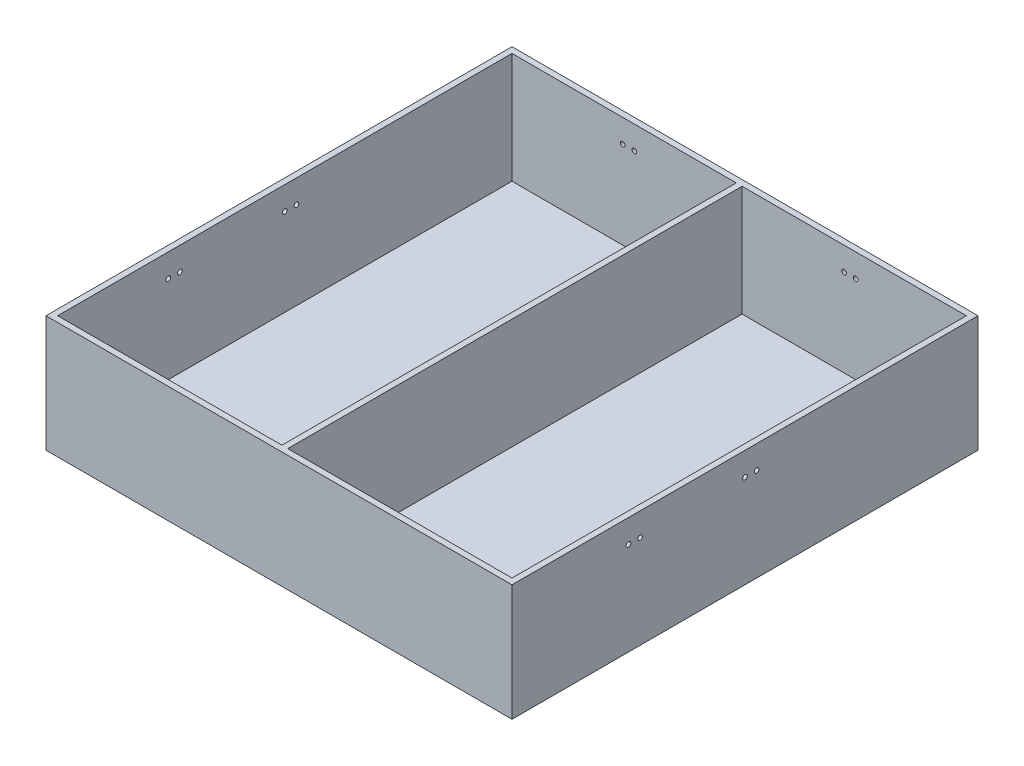
ISO-10303-21;
HEADER;
FILE_DESCRIPTION(('STEP AP214'),'2;1');
FILE_NAME('part.step','',(''),(''),'','','');
FILE_SCHEMA(('AUTOMOTIVE_DESIGN { 1 0 10303 214 1 1 1 1 }'));
ENDSEC;
DATA;
#1=APPLICATION_CONTEXT('core data for automotive mechanical design processes');
#2=APPLICATION_PROTOCOL_DEFINITION('international standard','automotive_design',2000,#1);
#3=PRODUCT_CONTEXT('',#1,'mechanical');
#4=PRODUCT('Part','Part','',(#3));
#5=PRODUCT_RELATED_PRODUCT_CATEGORY('part','',(#4));
#6=PRODUCT_DEFINITION_FORMATION('','',#4);
#7=PRODUCT_DEFINITION_CONTEXT('part definition',#1,'design');
#8=PRODUCT_DEFINITION('design','',#6,#7);
#9=PRODUCT_DEFINITION_SHAPE('','',#8);
#10=(LENGTH_UNIT() NAMED_UNIT(*) SI_UNIT(.MILLI.,.METRE.));
#11=(NAMED_UNIT(*) PLANE_ANGLE_UNIT() SI_UNIT($,.RADIAN.));
#12=(NAMED_UNIT(*) SI_UNIT($,.STERADIAN.) SOLID_ANGLE_UNIT());
#13=UNCERTAINTY_MEASURE_WITH_UNIT(LENGTH_MEASURE(1.E-05),#10,'distance_accuracy_value','');
#14=(GEOMETRIC_REPRESENTATION_CONTEXT(3) GLOBAL_UNCERTAINTY_ASSIGNED_CONTEXT((#13)) GLOBAL_UNIT_ASSIGNED_CONTEXT((#10,
#11,#12)) REPRESENTATION_CONTEXT('',''));
#15=CARTESIAN_POINT('',(0.,0.,0.));
#16=DIRECTION('',(0.,0.,1.));
#17=DIRECTION('',(1.,0.,0.));
#18=AXIS2_PLACEMENT_3D('',#15,#16,#17);
#19=CARTESIAN_POINT('',(0.,200.,0.));
#20=DIRECTION('',(0.,1.,0.));
#21=DIRECTION('',(0.,0.,1.));
#22=AXIS2_PLACEMENT_3D('',#19,#20,#21);
#23=PLANE('',#22);
#24=DIRECTION('',(0.,0.,1.));
#25=VECTOR('',#24,1.);
#26=CARTESIAN_POINT('',(5.,200.,390.));
#27=LINE('',#26,#25);
#28=CARTESIAN_POINT('',(5.00000000000006,200.,-390.));
#29=VERTEX_POINT('',#28);
#30=CARTESIAN_POINT('',(5.,200.,390.));
#31=VERTEX_POINT('',#30);
#32=EDGE_CURVE('E243',#29,#31,#27,.T.);
#33=ORIENTED_EDGE('',*,*,#32,.F.);
#34=DIRECTION('',(-1.,0.,0.));
#35=VECTOR('',#34,1.);
#36=CARTESIAN_POINT('',(5.00000000000006,200.,-390.));
#37=LINE('',#36,#35);
#38=CARTESIAN_POINT('',(390.,200.,-390.));
#39=VERTEX_POINT('',#38);
#40=EDGE_CURVE('E241',#39,#29,#37,.T.);
#41=ORIENTED_EDGE('',*,*,#40,.F.);
#42=DIRECTION('',(0.,0.,-1.));
#43=VECTOR('',#42,1.);
#44=CARTESIAN_POINT('',(390.,200.,-390.));
#45=LINE('',#44,#43);
#46=CARTESIAN_POINT('',(390.,200.,390.));
#47=VERTEX_POINT('',#46);
#48=EDGE_CURVE('E248',#47,#39,#45,.T.);
#49=ORIENTED_EDGE('',*,*,#48,.F.);
#50=DIRECTION('',(1.,0.,0.));
#51=VECTOR('',#50,1.);
#52=CARTESIAN_POINT('',(5.,200.,390.));
#53=LINE('',#52,#51);
#54=EDGE_CURVE('E245',#31,#47,#53,.T.);
#55=ORIENTED_EDGE('',*,*,#54,.F.);
#56=EDGE_LOOP('',(#33,#41,#49,#55));
#57=FACE_BOUND('',#56,.T.);
#58=DIRECTION('',(1.,0.,0.));
#59=VECTOR('',#58,1.);
#60=CARTESIAN_POINT('',(-390.,200.,390.));
#61=LINE('',#60,#59);
#62=CARTESIAN_POINT('',(-390.,200.,390.));
#63=VERTEX_POINT('',#62);
#64=CARTESIAN_POINT('',(-5.,200.,390.));
#65=VERTEX_POINT('',#64);
#66=EDGE_CURVE('E263',#63,#65,#61,.T.);
#67=ORIENTED_EDGE('',*,*,#66,.F.);
#68=DIRECTION('',(0.,0.,1.));
#69=VECTOR('',#68,1.);
#70=CARTESIAN_POINT('',(-390.,200.,-390.));
#71=LINE('',#70,#69);
#72=CARTESIAN_POINT('',(-390.,200.,-390.));
#73=VERTEX_POINT('',#72);
#74=EDGE_CURVE('E261',#73,#63,#71,.T.);
#75=ORIENTED_EDGE('',*,*,#74,.F.);
#76=DIRECTION('',(-1.,0.,0.));
#77=VECTOR('',#76,1.);
#78=CARTESIAN_POINT('',(-390.,200.,-390.));
#79=LINE('',#78,#77);
#80=CARTESIAN_POINT('',(-5.00000000000006,200.,-390.));
#81=VERTEX_POINT('',#80);
#82=EDGE_CURVE('E268',#81,#73,#79,.T.);
#83=ORIENTED_EDGE('',*,*,#82,.F.);
#84=DIRECTION('',(0.,0.,-1.));
#85=VECTOR('',#84,1.);
#86=CARTESIAN_POINT('',(-5.,200.,390.));
#87=LINE('',#86,#85);
#88=EDGE_CURVE('E265',#65,#81,#87,.T.);
#89=ORIENTED_EDGE('',*,*,#88,.F.);
#90=EDGE_LOOP('',(#67,#75,#83,#89));
#91=FACE_BOUND('',#90,.T.);
#92=DIRECTION('',(1.,0.,0.));
#93=VECTOR('',#92,1.);
#94=CARTESIAN_POINT('',(-400.,200.,-400.));
#95=LINE('',#94,#93);
#96=CARTESIAN_POINT('',(-400.,200.,-400.));
#97=VERTEX_POINT('',#96);
#98=CARTESIAN_POINT('',(400.,200.,-400.));
#99=VERTEX_POINT('',#98);
#100=EDGE_CURVE('E140',#97,#99,#95,.T.);
#101=ORIENTED_EDGE('',*,*,#100,.F.);
#102=DIRECTION('',(0.,0.,-1.));
#103=VECTOR('',#102,1.);
#104=CARTESIAN_POINT('',(-400.,200.,400.));
#105=LINE('',#104,#103);
#106=CARTESIAN_POINT('',(-400.,200.,400.));
#107=VERTEX_POINT('',#106);
#108=EDGE_CURVE('E148',#107,#97,#105,.T.);
#109=ORIENTED_EDGE('',*,*,#108,.F.);
#110=DIRECTION('',(1.,0.,0.));
#111=VECTOR('',#110,1.);
#112=CARTESIAN_POINT('',(-400.,200.,400.));
#113=LINE('',#112,#111);
#114=CARTESIAN_POINT('',(400.,200.,400.));
#115=VERTEX_POINT('',#114);
#116=EDGE_CURVE('E147',#107,#115,#113,.T.);
#117=ORIENTED_EDGE('',*,*,#116,.T.);
#118=DIRECTION('',(0.,0.,1.));
#119=VECTOR('',#118,1.);
#120=CARTESIAN_POINT('',(400.,200.,-400.));
#121=LINE('',#120,#119);
#122=EDGE_CURVE('E131',#99,#115,#121,.T.);
#123=ORIENTED_EDGE('',*,*,#122,.F.);
#124=EDGE_LOOP('',(#101,#109,#117,#123));
#125=FACE_BOUND('',#124,.T.);
#126=ADVANCED_FACE('F37',(#57,#91,#125),#23,.T.);
#127=CARTESIAN_POINT('',(-400.,200.,400.));
#128=DIRECTION('',(0.,0.,-1.));
#129=DIRECTION('',(-1.,0.,0.));
#130=AXIS2_PLACEMENT_3D('',#127,#128,#129);
#131=PLANE('',#130);
#132=ORIENTED_EDGE('',*,*,#116,.F.);
#133=DIRECTION('',(0.,-1.,0.));
#134=VECTOR('',#133,1.);
#135=CARTESIAN_POINT('',(-400.,200.,400.));
#136=LINE('',#135,#134);
#137=CARTESIAN_POINT('',(-400.,0.,400.));
#138=VERTEX_POINT('',#137);
#139=EDGE_CURVE('E290',#107,#138,#136,.T.);
#140=ORIENTED_EDGE('',*,*,#139,.T.);
#141=DIRECTION('',(1.,0.,0.));
#142=VECTOR('',#141,1.);
#143=CARTESIAN_POINT('',(-400.,0.,400.));
#144=LINE('',#143,#142);
#145=CARTESIAN_POINT('',(400.,0.,400.));
#146=VERTEX_POINT('',#145);
#147=EDGE_CURVE('E280',#138,#146,#144,.T.);
#148=ORIENTED_EDGE('',*,*,#147,.T.);
#149=DIRECTION('',(0.,-1.,0.));
#150=VECTOR('',#149,1.);
#151=CARTESIAN_POINT('',(400.,200.,400.));
#152=LINE('',#151,#150);
#153=EDGE_CURVE('E279',#115,#146,#152,.T.);
#154=ORIENTED_EDGE('',*,*,#153,.F.);
#155=EDGE_LOOP('',(#132,#140,#148,#154));
#156=FACE_BOUND('',#155,.T.);
#157=ADVANCED_FACE('F299',(#156),#131,.F.);
#158=CARTESIAN_POINT('',(0.,0.,0.));
#159=DIRECTION('',(0.,1.,0.));
#160=DIRECTION('',(0.,0.,1.));
#161=AXIS2_PLACEMENT_3D('',#158,#159,#160);
#162=PLANE('',#161);
#163=DIRECTION('',(0.,0.,-1.));
#164=VECTOR('',#163,1.);
#165=CARTESIAN_POINT('',(400.,0.,-400.));
#166=LINE('',#165,#164);
#167=CARTESIAN_POINT('',(400.,0.,-400.));
#168=VERTEX_POINT('',#167);
#169=EDGE_CURVE('E134',#146,#168,#166,.T.);
#170=ORIENTED_EDGE('',*,*,#169,.F.);
#171=ORIENTED_EDGE('',*,*,#147,.F.);
#172=DIRECTION('',(0.,0.,1.));
#173=VECTOR('',#172,1.);
#174=CARTESIAN_POINT('',(-400.,0.,-400.));
#175=LINE('',#174,#173);
#176=CARTESIAN_POINT('',(-400.,0.,-400.));
#177=VERTEX_POINT('',#176);
#178=EDGE_CURVE('E284',#177,#138,#175,.T.);
#179=ORIENTED_EDGE('',*,*,#178,.F.);
#180=DIRECTION('',(-1.,0.,0.));
#181=VECTOR('',#180,1.);
#182=CARTESIAN_POINT('',(-400.,0.,-400.));
#183=LINE('',#182,#181);
#184=EDGE_CURVE('E282',#168,#177,#183,.T.);
#185=ORIENTED_EDGE('',*,*,#184,.F.);
#186=EDGE_LOOP('',(#170,#171,#179,#185));
#187=FACE_BOUND('',#186,.T.);
#188=ADVANCED_FACE('F297',(#187),#162,.F.);
#189=CARTESIAN_POINT('',(400.,200.,-400.));
#190=DIRECTION('',(-1.,0.,0.));
#191=DIRECTION('',(0.,0.,1.));
#192=AXIS2_PLACEMENT_3D('',#189,#190,#191);
#193=PLANE('',#192);
#194=CARTESIAN_POINT('',(400.,159.999999999999,-20.));
#195=DIRECTION('',(-1.,0.,0.));
#196=DIRECTION('',(0.,0.,1.));
#197=AXIS2_PLACEMENT_3D('',#194,#195,#196);
#198=CIRCLE('',#197,3.99999999999999);
#199=CARTESIAN_POINT('',(400.,159.999999999999,-16.));
#200=VERTEX_POINT('',#199);
#201=EDGE_CURVE('E179',#200,#200,#198,.T.);
#202=ORIENTED_EDGE('',*,*,#201,.T.);
#203=EDGE_LOOP('',(#202));
#204=FACE_BOUND('',#203,.T.);
#205=CARTESIAN_POINT('',(400.,159.999999999999,0.));
#206=DIRECTION('',(-1.,0.,0.));
#207=DIRECTION('',(0.,0.,1.));
#208=AXIS2_PLACEMENT_3D('',#205,#206,#207);
#209=CIRCLE('',#208,3.99999999999999);
#210=CARTESIAN_POINT('',(400.,159.999999999999,3.99999999999999));
#211=VERTEX_POINT('',#210);
#212=EDGE_CURVE('E185',#211,#211,#209,.T.);
#213=ORIENTED_EDGE('',*,*,#212,.T.);
#214=EDGE_LOOP('',(#213));
#215=FACE_BOUND('',#214,.T.);
#216=CARTESIAN_POINT('',(400.,160.,180.));
#217=DIRECTION('',(-1.,0.,0.));
#218=DIRECTION('',(0.,0.,1.));
#219=AXIS2_PLACEMENT_3D('',#216,#217,#218);
#220=CIRCLE('',#219,3.99999999999999);
#221=CARTESIAN_POINT('',(400.,160.,184.));
#222=VERTEX_POINT('',#221);
#223=EDGE_CURVE('E191',#222,#222,#220,.T.);
#224=ORIENTED_EDGE('',*,*,#223,.T.);
#225=EDGE_LOOP('',(#224));
#226=FACE_BOUND('',#225,.T.);
#227=CARTESIAN_POINT('',(400.,160.,200.));
#228=DIRECTION('',(-1.,0.,0.));
#229=DIRECTION('',(0.,0.,1.));
#230=AXIS2_PLACEMENT_3D('',#227,#228,#229);
#231=CIRCLE('',#230,3.99999999999999);
#232=CARTESIAN_POINT('',(400.,160.,204.));
#233=VERTEX_POINT('',#232);
#234=EDGE_CURVE('E197',#233,#233,#231,.T.);
#235=ORIENTED_EDGE('',*,*,#234,.T.);
#236=EDGE_LOOP('',(#235));
#237=FACE_BOUND('',#236,.T.);
#238=DIRECTION('',(0.,-1.,0.));
#239=VECTOR('',#238,1.);
#240=CARTESIAN_POINT('',(400.,200.,-400.));
#241=LINE('',#240,#239);
#242=EDGE_CURVE('E45',#99,#168,#241,.T.);
#243=ORIENTED_EDGE('',*,*,#242,.F.);
#244=ORIENTED_EDGE('',*,*,#122,.T.);
#245=ORIENTED_EDGE('',*,*,#153,.T.);
#246=ORIENTED_EDGE('',*,*,#169,.T.);
#247=EDGE_LOOP('',(#243,#244,#245,#246));
#248=FACE_BOUND('',#247,.T.);
#249=ADVANCED_FACE('F39',(#204,#215,#226,#237,#248),#193,.F.);
#250=CARTESIAN_POINT('',(-400.,200.,-400.));
#251=DIRECTION('',(0.,0.,1.));
#252=DIRECTION('',(1.,0.,0.));
#253=AXIS2_PLACEMENT_3D('',#250,#251,#252);
#254=PLANE('',#253);
#255=CARTESIAN_POINT('',(-200.,160.,-400.));
#256=DIRECTION('',(0.,0.,1.));
#257=DIRECTION('',(1.,0.,0.));
#258=AXIS2_PLACEMENT_3D('',#255,#256,#257);
#259=CIRCLE('',#258,4.00000000000006);
#260=CARTESIAN_POINT('',(-196.,160.,-400.));
#261=VERTEX_POINT('',#260);
#262=EDGE_CURVE('E156',#261,#261,#259,.T.);
#263=ORIENTED_EDGE('',*,*,#262,.T.);
#264=EDGE_LOOP('',(#263));
#265=FACE_BOUND('',#264,.T.);
#266=CARTESIAN_POINT('',(-180.,160.,-400.));
#267=DIRECTION('',(0.,0.,1.));
#268=DIRECTION('',(1.,0.,0.));
#269=AXIS2_PLACEMENT_3D('',#266,#267,#268);
#270=CIRCLE('',#269,3.99999999999999);
#271=CARTESIAN_POINT('',(-176.,160.,-400.));
#272=VERTEX_POINT('',#271);
#273=EDGE_CURVE('E157',#272,#272,#270,.T.);
#274=ORIENTED_EDGE('',*,*,#273,.T.);
#275=EDGE_LOOP('',(#274));
#276=FACE_BOUND('',#275,.T.);
#277=CARTESIAN_POINT('',(200.,160.,-400.));
#278=DIRECTION('',(0.,0.,-1.));
#279=DIRECTION('',(-1.,0.,0.));
#280=AXIS2_PLACEMENT_3D('',#277,#278,#279);
#281=CIRCLE('',#280,4.00000000000006);
#282=CARTESIAN_POINT('',(196.,160.,-400.));
#283=VERTEX_POINT('',#282);
#284=EDGE_CURVE('E168',#283,#283,#281,.T.);
#285=ORIENTED_EDGE('',*,*,#284,.F.);
#286=EDGE_LOOP('',(#285));
#287=FACE_BOUND('',#286,.T.);
#288=CARTESIAN_POINT('',(180.,160.,-400.));
#289=DIRECTION('',(0.,0.,-1.));
#290=DIRECTION('',(-1.,0.,0.));
#291=AXIS2_PLACEMENT_3D('',#288,#289,#290);
#292=CIRCLE('',#291,3.99999999999999);
#293=CARTESIAN_POINT('',(176.,160.,-400.));
#294=VERTEX_POINT('',#293);
#295=EDGE_CURVE('E169',#294,#294,#292,.T.);
#296=ORIENTED_EDGE('',*,*,#295,.F.);
#297=EDGE_LOOP('',(#296));
#298=FACE_BOUND('',#297,.T.);
#299=DIRECTION('',(0.,-1.,0.));
#300=VECTOR('',#299,1.);
#301=CARTESIAN_POINT('',(-400.,200.,-400.));
#302=LINE('',#301,#300);
#303=EDGE_CURVE('E138',#97,#177,#302,.T.);
#304=ORIENTED_EDGE('',*,*,#303,.F.);
#305=ORIENTED_EDGE('',*,*,#100,.T.);
#306=ORIENTED_EDGE('',*,*,#242,.T.);
#307=ORIENTED_EDGE('',*,*,#184,.T.);
#308=EDGE_LOOP('',(#304,#305,#306,#307));
#309=FACE_BOUND('',#308,.T.);
#310=ADVANCED_FACE('F141',(#265,#276,#287,#298,#309),#254,.F.);
#311=CARTESIAN_POINT('',(-400.,200.,-400.));
#312=DIRECTION('',(1.,0.,0.));
#313=DIRECTION('',(0.,0.,-1.));
#314=AXIS2_PLACEMENT_3D('',#311,#312,#313);
#315=PLANE('',#314);
#316=CARTESIAN_POINT('',(-400.,160.,200.));
#317=DIRECTION('',(-1.,0.,0.));
#318=DIRECTION('',(0.,0.,1.));
#319=AXIS2_PLACEMENT_3D('',#316,#317,#318);
#320=CIRCLE('',#319,3.99999999999999);
#321=CARTESIAN_POINT('',(-400.,160.,204.));
#322=VERTEX_POINT('',#321);
#323=EDGE_CURVE('E210',#322,#322,#320,.T.);
#324=ORIENTED_EDGE('',*,*,#323,.F.);
#325=EDGE_LOOP('',(#324));
#326=FACE_BOUND('',#325,.T.);
#327=CARTESIAN_POINT('',(-400.,159.999999999999,-20.));
#328=DIRECTION('',(-1.,0.,0.));
#329=DIRECTION('',(0.,0.,1.));
#330=AXIS2_PLACEMENT_3D('',#327,#328,#329);
#331=CIRCLE('',#330,3.99999999999999);
#332=CARTESIAN_POINT('',(-400.,159.999999999999,-16.));
#333=VERTEX_POINT('',#332);
#334=EDGE_CURVE('E211',#333,#333,#331,.T.);
#335=ORIENTED_EDGE('',*,*,#334,.F.);
#336=EDGE_LOOP('',(#335));
#337=FACE_BOUND('',#336,.T.);
#338=CARTESIAN_POINT('',(-400.,159.999999999999,0.));
#339=DIRECTION('',(-1.,0.,0.));
#340=DIRECTION('',(0.,0.,1.));
#341=AXIS2_PLACEMENT_3D('',#338,#339,#340);
#342=CIRCLE('',#341,3.99999999999999);
#343=CARTESIAN_POINT('',(-400.,159.999999999999,3.99999999999999));
#344=VERTEX_POINT('',#343);
#345=EDGE_CURVE('E203',#344,#344,#342,.T.);
#346=ORIENTED_EDGE('',*,*,#345,.F.);
#347=EDGE_LOOP('',(#346));
#348=FACE_BOUND('',#347,.T.);
#349=CARTESIAN_POINT('',(-400.,160.,180.));
#350=DIRECTION('',(-1.,0.,0.));
#351=DIRECTION('',(0.,0.,1.));
#352=AXIS2_PLACEMENT_3D('',#349,#350,#351);
#353=CIRCLE('',#352,3.99999999999999);
#354=CARTESIAN_POINT('',(-400.,160.,184.));
#355=VERTEX_POINT('',#354);
#356=EDGE_CURVE('E221',#355,#355,#353,.T.);
#357=ORIENTED_EDGE('',*,*,#356,.F.);
#358=EDGE_LOOP('',(#357));
#359=FACE_BOUND('',#358,.T.);
#360=ORIENTED_EDGE('',*,*,#139,.F.);
#361=ORIENTED_EDGE('',*,*,#108,.T.);
#362=ORIENTED_EDGE('',*,*,#303,.T.);
#363=ORIENTED_EDGE('',*,*,#178,.T.);
#364=EDGE_LOOP('',(#360,#361,#362,#363));
#365=FACE_BOUND('',#364,.T.);
#366=ADVANCED_FACE('F293',(#326,#337,#348,#359,#365),#315,.F.);
#367=CARTESIAN_POINT('',(-390.,200.,-390.));
#368=DIRECTION('',(1.,0.,0.));
#369=DIRECTION('',(0.,0.,-1.));
#370=AXIS2_PLACEMENT_3D('',#367,#368,#369);
#371=PLANE('',#370);
#372=CARTESIAN_POINT('',(-390.,160.,200.));
#373=DIRECTION('',(1.,0.,0.));
#374=DIRECTION('',(0.,0.,-1.));
#375=AXIS2_PLACEMENT_3D('',#372,#373,#374);
#376=CIRCLE('',#375,3.99999999999999);
#377=CARTESIAN_POINT('',(-390.,160.,196.));
#378=VERTEX_POINT('',#377);
#379=EDGE_CURVE('E207',#378,#378,#376,.F.);
#380=ORIENTED_EDGE('',*,*,#379,.T.);
#381=EDGE_LOOP('',(#380));
#382=FACE_BOUND('',#381,.T.);
#383=CARTESIAN_POINT('',(-390.,159.999999999999,-20.));
#384=DIRECTION('',(1.,0.,0.));
#385=DIRECTION('',(0.,0.,-1.));
#386=AXIS2_PLACEMENT_3D('',#383,#384,#385);
#387=CIRCLE('',#386,3.99999999999999);
#388=CARTESIAN_POINT('',(-390.,159.999999999999,-24.));
#389=VERTEX_POINT('',#388);
#390=EDGE_CURVE('E206',#389,#389,#387,.F.);
#391=ORIENTED_EDGE('',*,*,#390,.T.);
#392=EDGE_LOOP('',(#391));
#393=FACE_BOUND('',#392,.T.);
#394=CARTESIAN_POINT('',(-390.,159.999999999999,0.));
#395=DIRECTION('',(1.,0.,0.));
#396=DIRECTION('',(0.,0.,-1.));
#397=AXIS2_PLACEMENT_3D('',#394,#395,#396);
#398=CIRCLE('',#397,3.99999999999999);
#399=CARTESIAN_POINT('',(-390.,159.999999999999,-3.99999999999999));
#400=VERTEX_POINT('',#399);
#401=EDGE_CURVE('E200',#400,#400,#398,.F.);
#402=ORIENTED_EDGE('',*,*,#401,.T.);
#403=EDGE_LOOP('',(#402));
#404=FACE_BOUND('',#403,.T.);
#405=CARTESIAN_POINT('',(-390.,160.,180.));
#406=DIRECTION('',(1.,0.,0.));
#407=DIRECTION('',(0.,0.,-1.));
#408=AXIS2_PLACEMENT_3D('',#405,#406,#407);
#409=CIRCLE('',#408,3.99999999999999);
#410=CARTESIAN_POINT('',(-390.,160.,176.));
#411=VERTEX_POINT('',#410);
#412=EDGE_CURVE('E214',#411,#411,#409,.F.);
#413=ORIENTED_EDGE('',*,*,#412,.T.);
#414=EDGE_LOOP('',(#413));
#415=FACE_BOUND('',#414,.T.);
#416=DIRECTION('',(0.,0.,1.));
#417=VECTOR('',#416,1.);
#418=CARTESIAN_POINT('',(-390.,10.,-390.));
#419=LINE('',#418,#417);
#420=CARTESIAN_POINT('',(-390.,10.,-390.));
#421=VERTEX_POINT('',#420);
#422=CARTESIAN_POINT('',(-390.,10.,390.));
#423=VERTEX_POINT('',#422);
#424=EDGE_CURVE('E238',#421,#423,#419,.T.);
#425=ORIENTED_EDGE('',*,*,#424,.F.);
#426=DIRECTION('',(0.,-1.,0.));
#427=VECTOR('',#426,1.);
#428=CARTESIAN_POINT('',(-390.,200.,-390.));
#429=LINE('',#428,#427);
#430=EDGE_CURVE('E270',#73,#421,#429,.T.);
#431=ORIENTED_EDGE('',*,*,#430,.F.);
#432=ORIENTED_EDGE('',*,*,#74,.T.);
#433=DIRECTION('',(0.,-1.,0.));
#434=VECTOR('',#433,1.);
#435=CARTESIAN_POINT('',(-390.,200.,390.));
#436=LINE('',#435,#434);
#437=EDGE_CURVE('E276',#63,#423,#436,.T.);
#438=ORIENTED_EDGE('',*,*,#437,.T.);
#439=EDGE_LOOP('',(#425,#431,#432,#438));
#440=FACE_BOUND('',#439,.T.);
#441=ADVANCED_FACE('F312',(#382,#393,#404,#415,#440),#371,.T.);
#442=CARTESIAN_POINT('',(-390.,200.,390.));
#443=DIRECTION('',(0.,0.,-1.));
#444=DIRECTION('',(-1.,0.,0.));
#445=AXIS2_PLACEMENT_3D('',#442,#443,#444);
#446=PLANE('',#445);
#447=DIRECTION('',(1.,0.,0.));
#448=VECTOR('',#447,1.);
#449=CARTESIAN_POINT('',(-390.,10.,390.));
#450=LINE('',#449,#448);
#451=CARTESIAN_POINT('',(-5.,10.,390.));
#452=VERTEX_POINT('',#451);
#453=EDGE_CURVE('E52',#423,#452,#450,.T.);
#454=ORIENTED_EDGE('',*,*,#453,.F.);
#455=ORIENTED_EDGE('',*,*,#437,.F.);
#456=ORIENTED_EDGE('',*,*,#66,.T.);
#457=DIRECTION('',(0.,-1.,0.));
#458=VECTOR('',#457,1.);
#459=CARTESIAN_POINT('',(-5.,200.,390.));
#460=LINE('',#459,#458);
#461=EDGE_CURVE('E274',#65,#452,#460,.T.);
#462=ORIENTED_EDGE('',*,*,#461,.T.);
#463=EDGE_LOOP('',(#454,#455,#456,#462));
#464=FACE_BOUND('',#463,.T.);
#465=ADVANCED_FACE('F401',(#464),#446,.T.);
#466=CARTESIAN_POINT('',(-5.,200.,390.));
#467=DIRECTION('',(-1.,0.,0.));
#468=DIRECTION('',(0.,0.,1.));
#469=AXIS2_PLACEMENT_3D('',#466,#467,#468);
#470=PLANE('',#469);
#471=DIRECTION('',(0.,0.,-1.));
#472=VECTOR('',#471,1.);
#473=CARTESIAN_POINT('',(-5.,10.,390.));
#474=LINE('',#473,#472);
#475=CARTESIAN_POINT('',(-5.00000000000006,10.,-390.));
#476=VERTEX_POINT('',#475);
#477=EDGE_CURVE('E60',#452,#476,#474,.T.);
#478=ORIENTED_EDGE('',*,*,#477,.F.);
#479=ORIENTED_EDGE('',*,*,#461,.F.);
#480=ORIENTED_EDGE('',*,*,#88,.T.);
#481=DIRECTION('',(0.,-1.,0.));
#482=VECTOR('',#481,1.);
#483=CARTESIAN_POINT('',(-5.00000000000006,200.,-390.));
#484=LINE('',#483,#482);
#485=EDGE_CURVE('E272',#81,#476,#484,.T.);
#486=ORIENTED_EDGE('',*,*,#485,.T.);
#487=EDGE_LOOP('',(#478,#479,#480,#486));
#488=FACE_BOUND('',#487,.T.);
#489=ADVANCED_FACE('F397',(#488),#470,.T.);
#490=CARTESIAN_POINT('',(-390.,200.,-390.));
#491=DIRECTION('',(0.,0.,1.));
#492=DIRECTION('',(1.,0.,0.));
#493=AXIS2_PLACEMENT_3D('',#490,#491,#492);
#494=PLANE('',#493);
#495=CARTESIAN_POINT('',(-200.,160.,-390.));
#496=DIRECTION('',(0.,0.,1.));
#497=DIRECTION('',(1.,0.,0.));
#498=AXIS2_PLACEMENT_3D('',#495,#496,#497);
#499=CIRCLE('',#498,4.00000000000006);
#500=CARTESIAN_POINT('',(-196.,160.,-390.));
#501=VERTEX_POINT('',#500);
#502=EDGE_CURVE('E153',#501,#501,#499,.T.);
#503=ORIENTED_EDGE('',*,*,#502,.F.);
#504=EDGE_LOOP('',(#503));
#505=FACE_BOUND('',#504,.T.);
#506=CARTESIAN_POINT('',(-180.,160.,-390.));
#507=DIRECTION('',(0.,0.,1.));
#508=DIRECTION('',(1.,0.,0.));
#509=AXIS2_PLACEMENT_3D('',#506,#507,#508);
#510=CIRCLE('',#509,3.99999999999999);
#511=CARTESIAN_POINT('',(-176.,160.,-390.));
#512=VERTEX_POINT('',#511);
#513=EDGE_CURVE('E150',#512,#512,#510,.T.);
#514=ORIENTED_EDGE('',*,*,#513,.F.);
#515=EDGE_LOOP('',(#514));
#516=FACE_BOUND('',#515,.T.);
#517=DIRECTION('',(-1.,0.,0.));
#518=VECTOR('',#517,1.);
#519=CARTESIAN_POINT('',(-390.,10.,-390.));
#520=LINE('',#519,#518);
#521=EDGE_CURVE('E233',#476,#421,#520,.T.);
#522=ORIENTED_EDGE('',*,*,#521,.F.);
#523=ORIENTED_EDGE('',*,*,#485,.F.);
#524=ORIENTED_EDGE('',*,*,#82,.T.);
#525=ORIENTED_EDGE('',*,*,#430,.T.);
#526=EDGE_LOOP('',(#522,#523,#524,#525));
#527=FACE_BOUND('',#526,.T.);
#528=ADVANCED_FACE('F393',(#505,#516,#527),#494,.T.);
#529=CARTESIAN_POINT('',(5.00000000000006,200.,-390.));
#530=DIRECTION('',(0.,0.,1.));
#531=DIRECTION('',(1.,0.,0.));
#532=AXIS2_PLACEMENT_3D('',#529,#530,#531);
#533=PLANE('',#532);
#534=CARTESIAN_POINT('',(200.,160.,-390.));
#535=DIRECTION('',(0.,0.,1.));
#536=DIRECTION('',(1.,0.,0.));
#537=AXIS2_PLACEMENT_3D('',#534,#535,#536);
#538=CIRCLE('',#537,4.00000000000006);
#539=CARTESIAN_POINT('',(204.,160.,-390.));
#540=VERTEX_POINT('',#539);
#541=EDGE_CURVE('E165',#540,#540,#538,.F.);
#542=ORIENTED_EDGE('',*,*,#541,.T.);
#543=EDGE_LOOP('',(#542));
#544=FACE_BOUND('',#543,.T.);
#545=CARTESIAN_POINT('',(180.,160.,-390.));
#546=DIRECTION('',(0.,0.,1.));
#547=DIRECTION('',(1.,0.,0.));
#548=AXIS2_PLACEMENT_3D('',#545,#546,#547);
#549=CIRCLE('',#548,3.99999999999999);
#550=CARTESIAN_POINT('',(184.,160.,-390.));
#551=VERTEX_POINT('',#550);
#552=EDGE_CURVE('E160',#551,#551,#549,.F.);
#553=ORIENTED_EDGE('',*,*,#552,.T.);
#554=EDGE_LOOP('',(#553));
#555=FACE_BOUND('',#554,.T.);
#556=DIRECTION('',(-1.,0.,0.));
#557=VECTOR('',#556,1.);
#558=CARTESIAN_POINT('',(5.00000000000006,10.,-390.));
#559=LINE('',#558,#557);
#560=CARTESIAN_POINT('',(390.,10.,-390.));
#561=VERTEX_POINT('',#560);
#562=CARTESIAN_POINT('',(5.00000000000006,10.,-390.));
#563=VERTEX_POINT('',#562);
#564=EDGE_CURVE('E230',#561,#563,#559,.T.);
#565=ORIENTED_EDGE('',*,*,#564,.F.);
#566=DIRECTION('',(0.,-1.,0.));
#567=VECTOR('',#566,1.);
#568=CARTESIAN_POINT('',(390.,200.,-390.));
#569=LINE('',#568,#567);
#570=EDGE_CURVE('E250',#39,#561,#569,.T.);
#571=ORIENTED_EDGE('',*,*,#570,.F.);
#572=ORIENTED_EDGE('',*,*,#40,.T.);
#573=DIRECTION('',(0.,-1.,0.));
#574=VECTOR('',#573,1.);
#575=CARTESIAN_POINT('',(5.00000000000006,200.,-390.));
#576=LINE('',#575,#574);
#577=EDGE_CURVE('E258',#29,#563,#576,.T.);
#578=ORIENTED_EDGE('',*,*,#577,.T.);
#579=EDGE_LOOP('',(#565,#571,#572,#578));
#580=FACE_BOUND('',#579,.T.);
#581=ADVANCED_FACE('F389',(#544,#555,#580),#533,.T.);
#582=CARTESIAN_POINT('',(5.,200.,390.));
#583=DIRECTION('',(1.,0.,0.));
#584=DIRECTION('',(0.,0.,-1.));
#585=AXIS2_PLACEMENT_3D('',#582,#583,#584);
#586=PLANE('',#585);
#587=DIRECTION('',(0.,0.,1.));
#588=VECTOR('',#587,1.);
#589=CARTESIAN_POINT('',(5.,10.,390.));
#590=LINE('',#589,#588);
#591=CARTESIAN_POINT('',(5.,10.,390.));
#592=VERTEX_POINT('',#591);
#593=EDGE_CURVE('E227',#563,#592,#590,.T.);
#594=ORIENTED_EDGE('',*,*,#593,.F.);
#595=ORIENTED_EDGE('',*,*,#577,.F.);
#596=ORIENTED_EDGE('',*,*,#32,.T.);
#597=DIRECTION('',(0.,-1.,0.));
#598=VECTOR('',#597,1.);
#599=CARTESIAN_POINT('',(5.,200.,390.));
#600=LINE('',#599,#598);
#601=EDGE_CURVE('E255',#31,#592,#600,.T.);
#602=ORIENTED_EDGE('',*,*,#601,.T.);
#603=EDGE_LOOP('',(#594,#595,#596,#602));
#604=FACE_BOUND('',#603,.T.);
#605=ADVANCED_FACE('F385',(#604),#586,.T.);
#606=CARTESIAN_POINT('',(5.,200.,390.));
#607=DIRECTION('',(0.,0.,-1.));
#608=DIRECTION('',(-1.,0.,0.));
#609=AXIS2_PLACEMENT_3D('',#606,#607,#608);
#610=PLANE('',#609);
#611=DIRECTION('',(1.,0.,0.));
#612=VECTOR('',#611,1.);
#613=CARTESIAN_POINT('',(5.,10.,390.));
#614=LINE('',#613,#612);
#615=CARTESIAN_POINT('',(390.,10.,390.));
#616=VERTEX_POINT('',#615);
#617=EDGE_CURVE('E224',#592,#616,#614,.T.);
#618=ORIENTED_EDGE('',*,*,#617,.F.);
#619=ORIENTED_EDGE('',*,*,#601,.F.);
#620=ORIENTED_EDGE('',*,*,#54,.T.);
#621=DIRECTION('',(0.,-1.,0.));
#622=VECTOR('',#621,1.);
#623=CARTESIAN_POINT('',(390.,200.,390.));
#624=LINE('',#623,#622);
#625=EDGE_CURVE('E252',#47,#616,#624,.T.);
#626=ORIENTED_EDGE('',*,*,#625,.T.);
#627=EDGE_LOOP('',(#618,#619,#620,#626));
#628=FACE_BOUND('',#627,.T.);
#629=ADVANCED_FACE('F381',(#628),#610,.T.);
#630=CARTESIAN_POINT('',(390.,200.,-390.));
#631=DIRECTION('',(-1.,0.,0.));
#632=DIRECTION('',(0.,0.,1.));
#633=AXIS2_PLACEMENT_3D('',#630,#631,#632);
#634=PLANE('',#633);
#635=CARTESIAN_POINT('',(390.,159.999999999999,-20.));
#636=DIRECTION('',(1.,0.,0.));
#637=DIRECTION('',(0.,0.,-1.));
#638=AXIS2_PLACEMENT_3D('',#635,#636,#637);
#639=CIRCLE('',#638,3.99999999999999);
#640=CARTESIAN_POINT('',(390.,159.999999999999,-24.));
#641=VERTEX_POINT('',#640);
#642=EDGE_CURVE('E172',#641,#641,#639,.F.);
#643=ORIENTED_EDGE('',*,*,#642,.F.);
#644=EDGE_LOOP('',(#643));
#645=FACE_BOUND('',#644,.T.);
#646=CARTESIAN_POINT('',(390.,159.999999999999,0.));
#647=DIRECTION('',(1.,0.,0.));
#648=DIRECTION('',(0.,0.,-1.));
#649=AXIS2_PLACEMENT_3D('',#646,#647,#648);
#650=CIRCLE('',#649,3.99999999999999);
#651=CARTESIAN_POINT('',(390.,159.999999999999,-3.99999999999999));
#652=VERTEX_POINT('',#651);
#653=EDGE_CURVE('E182',#652,#652,#650,.F.);
#654=ORIENTED_EDGE('',*,*,#653,.F.);
#655=EDGE_LOOP('',(#654));
#656=FACE_BOUND('',#655,.T.);
#657=CARTESIAN_POINT('',(390.,160.,180.));
#658=DIRECTION('',(1.,0.,0.));
#659=DIRECTION('',(0.,0.,-1.));
#660=AXIS2_PLACEMENT_3D('',#657,#658,#659);
#661=CIRCLE('',#660,3.99999999999999);
#662=CARTESIAN_POINT('',(390.,160.,176.));
#663=VERTEX_POINT('',#662);
#664=EDGE_CURVE('E188',#663,#663,#661,.F.);
#665=ORIENTED_EDGE('',*,*,#664,.F.);
#666=EDGE_LOOP('',(#665));
#667=FACE_BOUND('',#666,.T.);
#668=CARTESIAN_POINT('',(390.,160.,200.));
#669=DIRECTION('',(1.,0.,0.));
#670=DIRECTION('',(0.,0.,-1.));
#671=AXIS2_PLACEMENT_3D('',#668,#669,#670);
#672=CIRCLE('',#671,3.99999999999999);
#673=CARTESIAN_POINT('',(390.,160.,196.));
#674=VERTEX_POINT('',#673);
#675=EDGE_CURVE('E194',#674,#674,#672,.F.);
#676=ORIENTED_EDGE('',*,*,#675,.F.);
#677=EDGE_LOOP('',(#676));
#678=FACE_BOUND('',#677,.T.);
#679=DIRECTION('',(0.,0.,-1.));
#680=VECTOR('',#679,1.);
#681=CARTESIAN_POINT('',(390.,10.,-390.));
#682=LINE('',#681,#680);
#683=EDGE_CURVE('E11',#616,#561,#682,.T.);
#684=ORIENTED_EDGE('',*,*,#683,.F.);
#685=ORIENTED_EDGE('',*,*,#625,.F.);
#686=ORIENTED_EDGE('',*,*,#48,.T.);
#687=ORIENTED_EDGE('',*,*,#570,.T.);
#688=EDGE_LOOP('',(#684,#685,#686,#687));
#689=FACE_BOUND('',#688,.T.);
#690=ADVANCED_FACE('F377',(#645,#656,#667,#678,#689),#634,.T.);
#691=CARTESIAN_POINT('',(0.,10.,0.));
#692=DIRECTION('',(0.,1.,0.));
#693=DIRECTION('',(0.,0.,1.));
#694=AXIS2_PLACEMENT_3D('',#691,#692,#693);
#695=PLANE('',#694);
#696=ORIENTED_EDGE('',*,*,#683,.T.);
#697=ORIENTED_EDGE('',*,*,#564,.T.);
#698=ORIENTED_EDGE('',*,*,#593,.T.);
#699=ORIENTED_EDGE('',*,*,#617,.T.);
#700=EDGE_LOOP('',(#696,#697,#698,#699));
#701=FACE_BOUND('',#700,.T.);
#702=ADVANCED_FACE('F374',(#701),#695,.T.);
#703=ORIENTED_EDGE('',*,*,#521,.T.);
#704=ORIENTED_EDGE('',*,*,#424,.T.);
#705=ORIENTED_EDGE('',*,*,#453,.T.);
#706=ORIENTED_EDGE('',*,*,#477,.T.);
#707=EDGE_LOOP('',(#703,#704,#705,#706));
#708=FACE_BOUND('',#707,.T.);
#709=ADVANCED_FACE('F372',(#708),#695,.T.);
#710=CARTESIAN_POINT('',(705.573809000084,160.,180.));
#711=DIRECTION('',(-1.,0.,0.));
#712=DIRECTION('',(0.,0.,1.));
#713=AXIS2_PLACEMENT_3D('',#710,#711,#712);
#714=CYLINDRICAL_SURFACE('',#713,3.99999999999999);
#715=ORIENTED_EDGE('',*,*,#412,.F.);
#716=EDGE_LOOP('',(#715));
#717=FACE_BOUND('',#716,.T.);
#718=ORIENTED_EDGE('',*,*,#356,.T.);
#719=EDGE_LOOP('',(#718));
#720=FACE_BOUND('',#719,.T.);
#721=ADVANCED_FACE('F362',(#717,#720),#714,.F.);
#722=CARTESIAN_POINT('',(705.573809000084,159.999999999999,0.));
#723=DIRECTION('',(-1.,0.,0.));
#724=DIRECTION('',(0.,0.,1.));
#725=AXIS2_PLACEMENT_3D('',#722,#723,#724);
#726=CYLINDRICAL_SURFACE('',#725,3.99999999999999);
#727=ORIENTED_EDGE('',*,*,#401,.F.);
#728=EDGE_LOOP('',(#727));
#729=FACE_BOUND('',#728,.T.);
#730=ORIENTED_EDGE('',*,*,#345,.T.);
#731=EDGE_LOOP('',(#730));
#732=FACE_BOUND('',#731,.T.);
#733=ADVANCED_FACE('F358',(#729,#732),#726,.F.);
#734=CARTESIAN_POINT('',(705.573809000084,159.999999999999,-20.));
#735=DIRECTION('',(-1.,0.,0.));
#736=DIRECTION('',(0.,0.,1.));
#737=AXIS2_PLACEMENT_3D('',#734,#735,#736);
#738=CYLINDRICAL_SURFACE('',#737,3.99999999999999);
#739=ORIENTED_EDGE('',*,*,#390,.F.);
#740=EDGE_LOOP('',(#739));
#741=FACE_BOUND('',#740,.T.);
#742=ORIENTED_EDGE('',*,*,#334,.T.);
#743=EDGE_LOOP('',(#742));
#744=FACE_BOUND('',#743,.T.);
#745=ADVANCED_FACE('F361',(#741,#744),#738,.F.);
#746=CARTESIAN_POINT('',(705.573809000084,160.,200.));
#747=DIRECTION('',(-1.,0.,0.));
#748=DIRECTION('',(0.,0.,1.));
#749=AXIS2_PLACEMENT_3D('',#746,#747,#748);
#750=CYLINDRICAL_SURFACE('',#749,3.99999999999999);
#751=ORIENTED_EDGE('',*,*,#379,.F.);
#752=EDGE_LOOP('',(#751));
#753=FACE_BOUND('',#752,.T.);
#754=ORIENTED_EDGE('',*,*,#323,.T.);
#755=EDGE_LOOP('',(#754));
#756=FACE_BOUND('',#755,.T.);
#757=ADVANCED_FACE('F356',(#753,#756),#750,.F.);
#758=CARTESIAN_POINT('',(-705.573809000084,160.,200.));
#759=DIRECTION('',(1.,0.,0.));
#760=DIRECTION('',(0.,0.,1.));
#761=AXIS2_PLACEMENT_3D('',#758,#759,#760);
#762=CYLINDRICAL_SURFACE('',#761,3.99999999999999);
#763=ORIENTED_EDGE('',*,*,#675,.T.);
#764=EDGE_LOOP('',(#763));
#765=FACE_BOUND('',#764,.T.);
#766=ORIENTED_EDGE('',*,*,#234,.F.);
#767=EDGE_LOOP('',(#766));
#768=FACE_BOUND('',#767,.T.);
#769=ADVANCED_FACE('F352',(#765,#768),#762,.F.);
#770=CARTESIAN_POINT('',(-705.573809000084,160.,180.));
#771=DIRECTION('',(1.,0.,0.));
#772=DIRECTION('',(0.,0.,1.));
#773=AXIS2_PLACEMENT_3D('',#770,#771,#772);
#774=CYLINDRICAL_SURFACE('',#773,3.99999999999999);
#775=ORIENTED_EDGE('',*,*,#664,.T.);
#776=EDGE_LOOP('',(#775));
#777=FACE_BOUND('',#776,.T.);
#778=ORIENTED_EDGE('',*,*,#223,.F.);
#779=EDGE_LOOP('',(#778));
#780=FACE_BOUND('',#779,.T.);
#781=ADVANCED_FACE('F348',(#777,#780),#774,.F.);
#782=CARTESIAN_POINT('',(-705.573809000084,159.999999999999,0.));
#783=DIRECTION('',(1.,0.,0.));
#784=DIRECTION('',(0.,0.,1.));
#785=AXIS2_PLACEMENT_3D('',#782,#783,#784);
#786=CYLINDRICAL_SURFACE('',#785,3.99999999999999);
#787=ORIENTED_EDGE('',*,*,#653,.T.);
#788=EDGE_LOOP('',(#787));
#789=FACE_BOUND('',#788,.T.);
#790=ORIENTED_EDGE('',*,*,#212,.F.);
#791=EDGE_LOOP('',(#790));
#792=FACE_BOUND('',#791,.T.);
#793=ADVANCED_FACE('F340',(#789,#792),#786,.F.);
#794=CARTESIAN_POINT('',(-705.573809000084,159.999999999999,-20.));
#795=DIRECTION('',(1.,0.,0.));
#796=DIRECTION('',(0.,0.,1.));
#797=AXIS2_PLACEMENT_3D('',#794,#795,#796);
#798=CYLINDRICAL_SURFACE('',#797,3.99999999999999);
#799=ORIENTED_EDGE('',*,*,#642,.T.);
#800=EDGE_LOOP('',(#799));
#801=FACE_BOUND('',#800,.T.);
#802=ORIENTED_EDGE('',*,*,#201,.F.);
#803=EDGE_LOOP('',(#802));
#804=FACE_BOUND('',#803,.T.);
#805=ADVANCED_FACE('F330',(#801,#804),#798,.F.);
#806=CARTESIAN_POINT('',(180.,160.,400.001));
#807=DIRECTION('',(0.,0.,-1.));
#808=DIRECTION('',(-1.,0.,0.));
#809=AXIS2_PLACEMENT_3D('',#806,#807,#808);
#810=CYLINDRICAL_SURFACE('',#809,3.99999999999999);
#811=ORIENTED_EDGE('',*,*,#552,.F.);
#812=EDGE_LOOP('',(#811));
#813=FACE_BOUND('',#812,.T.);
#814=ORIENTED_EDGE('',*,*,#295,.T.);
#815=EDGE_LOOP('',(#814));
#816=FACE_BOUND('',#815,.T.);
#817=ADVANCED_FACE('F327',(#813,#816),#810,.F.);
#818=CARTESIAN_POINT('',(200.,160.,400.001));
#819=DIRECTION('',(0.,0.,-1.));
#820=DIRECTION('',(-1.,0.,0.));
#821=AXIS2_PLACEMENT_3D('',#818,#819,#820);
#822=CYLINDRICAL_SURFACE('',#821,4.00000000000006);
#823=ORIENTED_EDGE('',*,*,#541,.F.);
#824=EDGE_LOOP('',(#823));
#825=FACE_BOUND('',#824,.T.);
#826=ORIENTED_EDGE('',*,*,#284,.T.);
#827=EDGE_LOOP('',(#826));
#828=FACE_BOUND('',#827,.T.);
#829=ADVANCED_FACE('F329',(#825,#828),#822,.F.);
#830=CARTESIAN_POINT('',(-180.,160.,400.001));
#831=DIRECTION('',(0.,0.,-1.));
#832=DIRECTION('',(-1.,0.,0.));
#833=AXIS2_PLACEMENT_3D('',#830,#831,#832);
#834=CYLINDRICAL_SURFACE('',#833,3.99999999999999);
#835=ORIENTED_EDGE('',*,*,#513,.T.);
#836=EDGE_LOOP('',(#835));
#837=FACE_BOUND('',#836,.T.);
#838=ORIENTED_EDGE('',*,*,#273,.F.);
#839=EDGE_LOOP('',(#838));
#840=FACE_BOUND('',#839,.T.);
#841=ADVANCED_FACE('F337',(#837,#840),#834,.F.);
#842=CARTESIAN_POINT('',(-200.,160.,400.001));
#843=DIRECTION('',(0.,0.,-1.));
#844=DIRECTION('',(-1.,0.,0.));
#845=AXIS2_PLACEMENT_3D('',#842,#843,#844);
#846=CYLINDRICAL_SURFACE('',#845,4.00000000000006);
#847=ORIENTED_EDGE('',*,*,#502,.T.);
#848=EDGE_LOOP('',(#847));
#849=FACE_BOUND('',#848,.T.);
#850=ORIENTED_EDGE('',*,*,#262,.F.);
#851=EDGE_LOOP('',(#850));
#852=FACE_BOUND('',#851,.T.);
#853=ADVANCED_FACE('F443',(#849,#852),#846,.F.);
#854=CLOSED_SHELL('',(#126,#157,#188,#249,#310,#366,#441,#465,#489,#528,#581,#605,#629,#690,
#702,#709,#721,#733,#745,#757,#769,#781,#793,#805,#817,#829,#841,#853));
#855=MANIFOLD_SOLID_BREP('B2',#854);
#856=ADVANCED_BREP_SHAPE_REPRESENTATION('',(#18,#855),#14);
#857=SHAPE_DEFINITION_REPRESENTATION(#9,#856);
ENDSEC;
END-ISO-10303-21;
